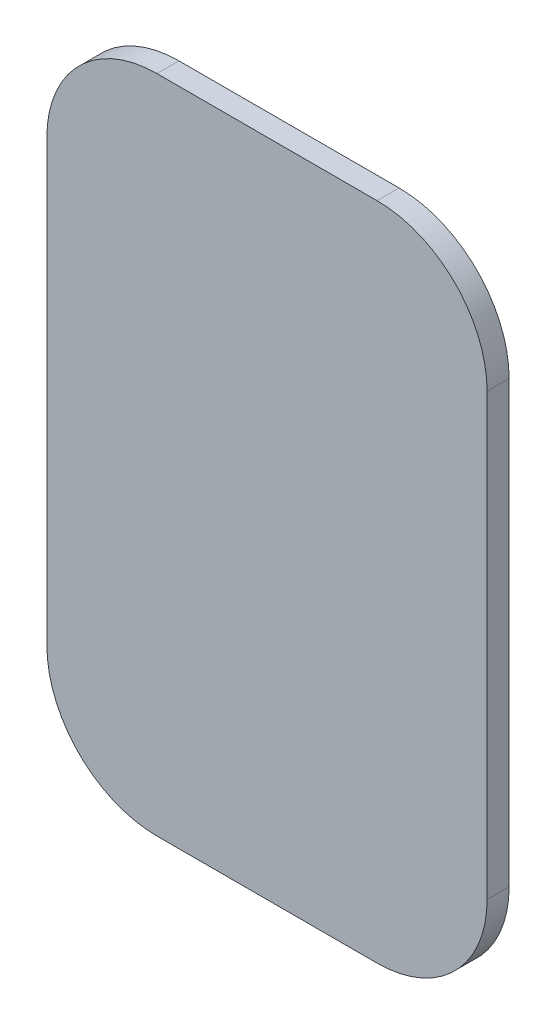
ISO-10303-21;
HEADER;
FILE_DESCRIPTION(('STEP AP214'),'2;1');
FILE_NAME('part.step','',(''),(''),'','','');
FILE_SCHEMA(('AUTOMOTIVE_DESIGN { 1 0 10303 214 1 1 1 1 }'));
ENDSEC;
DATA;
#1=APPLICATION_CONTEXT('core data for automotive mechanical design processes');
#2=APPLICATION_PROTOCOL_DEFINITION('international standard','automotive_design',2000,#1);
#3=PRODUCT_CONTEXT('',#1,'mechanical');
#4=PRODUCT('Part','Part','',(#3));
#5=PRODUCT_RELATED_PRODUCT_CATEGORY('part','',(#4));
#6=PRODUCT_DEFINITION_FORMATION('','',#4);
#7=PRODUCT_DEFINITION_CONTEXT('part definition',#1,'design');
#8=PRODUCT_DEFINITION('design','',#6,#7);
#9=PRODUCT_DEFINITION_SHAPE('','',#8);
#10=(LENGTH_UNIT() NAMED_UNIT(*) SI_UNIT(.MILLI.,.METRE.));
#11=(NAMED_UNIT(*) PLANE_ANGLE_UNIT() SI_UNIT($,.RADIAN.));
#12=(NAMED_UNIT(*) SI_UNIT($,.STERADIAN.) SOLID_ANGLE_UNIT());
#13=UNCERTAINTY_MEASURE_WITH_UNIT(LENGTH_MEASURE(1.E-05),#10,'distance_accuracy_value','');
#14=(GEOMETRIC_REPRESENTATION_CONTEXT(3) GLOBAL_UNCERTAINTY_ASSIGNED_CONTEXT((#13)) GLOBAL_UNIT_ASSIGNED_CONTEXT((#10,
#11,#12)) REPRESENTATION_CONTEXT('',''));
#15=CARTESIAN_POINT('',(0.,0.,0.));
#16=DIRECTION('',(0.,0.,1.));
#17=DIRECTION('',(1.,0.,0.));
#18=AXIS2_PLACEMENT_3D('',#15,#16,#17);
#19=CARTESIAN_POINT('',(13.7838920146643,-25.264510751792,-2.54));
#20=DIRECTION('',(0.,0.,1.));
#21=DIRECTION('',(1.,0.,0.));
#22=AXIS2_PLACEMENT_3D('',#19,#20,#21);
#23=CYLINDRICAL_SURFACE('',#22,12.7);
#24=CARTESIAN_POINT('',(13.7838920146643,-25.264510751792,0.));
#25=DIRECTION('',(0.,0.,1.));
#26=DIRECTION('',(1.,0.,0.));
#27=AXIS2_PLACEMENT_3D('',#24,#25,#26);
#28=CIRCLE('',#27,12.7);
#29=CARTESIAN_POINT('',(13.7838920146643,-37.964510751792,0.));
#30=VERTEX_POINT('',#29);
#31=CARTESIAN_POINT('',(26.4838920146643,-25.264510751792,0.));
#32=VERTEX_POINT('',#31);
#33=EDGE_CURVE('E138',#30,#32,#28,.T.);
#34=ORIENTED_EDGE('',*,*,#33,.F.);
#35=DIRECTION('',(0.,0.,1.));
#36=VECTOR('',#35,1.);
#37=CARTESIAN_POINT('',(13.7838920146643,-37.964510751792,-2.54));
#38=LINE('',#37,#36);
#39=CARTESIAN_POINT('',(13.7838920146643,-37.964510751792,-2.54));
#40=VERTEX_POINT('',#39);
#41=EDGE_CURVE('E11',#40,#30,#38,.T.);
#42=ORIENTED_EDGE('',*,*,#41,.F.);
#43=CARTESIAN_POINT('',(13.7838920146643,-25.264510751792,-2.54));
#44=DIRECTION('',(0.,0.,1.));
#45=DIRECTION('',(1.,0.,0.));
#46=AXIS2_PLACEMENT_3D('',#43,#44,#45);
#47=CIRCLE('',#46,12.7);
#48=CARTESIAN_POINT('',(26.4838920146643,-25.264510751792,-2.54));
#49=VERTEX_POINT('',#48);
#50=EDGE_CURVE('E158',#40,#49,#47,.T.);
#51=ORIENTED_EDGE('',*,*,#50,.T.);
#52=DIRECTION('',(0.,0.,1.));
#53=VECTOR('',#52,1.);
#54=CARTESIAN_POINT('',(26.4838920146643,-25.264510751792,-2.54));
#55=LINE('',#54,#53);
#56=EDGE_CURVE('E44',#49,#32,#55,.T.);
#57=ORIENTED_EDGE('',*,*,#56,.T.);
#58=EDGE_LOOP('',(#34,#42,#51,#57));
#59=FACE_BOUND('',#58,.T.);
#60=ADVANCED_FACE('F41',(#59),#23,.T.);
#61=CARTESIAN_POINT('',(-11.6160640433357,-37.964510751792,-2.54));
#62=DIRECTION('',(0.,-1.,0.));
#63=DIRECTION('',(0.,0.,-1.));
#64=AXIS2_PLACEMENT_3D('',#61,#62,#63);
#65=PLANE('',#64);
#66=DIRECTION('',(1.,0.,0.));
#67=VECTOR('',#66,1.);
#68=CARTESIAN_POINT('',(-11.6160640433357,-37.964510751792,0.));
#69=LINE('',#68,#67);
#70=CARTESIAN_POINT('',(-11.6160640433357,-37.964510751792,0.));
#71=VERTEX_POINT('',#70);
#72=EDGE_CURVE('E156',#71,#30,#69,.T.);
#73=ORIENTED_EDGE('',*,*,#72,.F.);
#74=DIRECTION('',(0.,0.,1.));
#75=VECTOR('',#74,1.);
#76=CARTESIAN_POINT('',(-11.6160640433357,-37.964510751792,-2.54));
#77=LINE('',#76,#75);
#78=CARTESIAN_POINT('',(-11.6160640433357,-37.964510751792,-2.54));
#79=VERTEX_POINT('',#78);
#80=EDGE_CURVE('E50',#79,#71,#77,.T.);
#81=ORIENTED_EDGE('',*,*,#80,.F.);
#82=DIRECTION('',(1.,0.,0.));
#83=VECTOR('',#82,1.);
#84=CARTESIAN_POINT('',(-11.6160640433357,-37.964510751792,-2.54));
#85=LINE('',#84,#83);
#86=EDGE_CURVE('E128',#79,#40,#85,.T.);
#87=ORIENTED_EDGE('',*,*,#86,.T.);
#88=ORIENTED_EDGE('',*,*,#41,.T.);
#89=EDGE_LOOP('',(#73,#81,#87,#88));
#90=FACE_BOUND('',#89,.T.);
#91=ADVANCED_FACE('F170',(#90),#65,.T.);
#92=CARTESIAN_POINT('',(-11.6160640433357,-25.264510751792,-2.54));
#93=DIRECTION('',(0.,0.,1.));
#94=DIRECTION('',(1.,0.,0.));
#95=AXIS2_PLACEMENT_3D('',#92,#93,#94);
#96=CYLINDRICAL_SURFACE('',#95,12.7);
#97=CARTESIAN_POINT('',(-11.6160640433357,-25.264510751792,0.));
#98=DIRECTION('',(0.,0.,1.));
#99=DIRECTION('',(1.,0.,0.));
#100=AXIS2_PLACEMENT_3D('',#97,#98,#99);
#101=CIRCLE('',#100,12.7);
#102=CARTESIAN_POINT('',(-24.3160640433357,-25.264510751792,0.));
#103=VERTEX_POINT('',#102);
#104=EDGE_CURVE('E115',#103,#71,#101,.T.);
#105=ORIENTED_EDGE('',*,*,#104,.F.);
#106=DIRECTION('',(0.,0.,1.));
#107=VECTOR('',#106,1.);
#108=CARTESIAN_POINT('',(-24.3160640433357,-25.264510751792,-2.54));
#109=LINE('',#108,#107);
#110=CARTESIAN_POINT('',(-24.3160640433357,-25.264510751792,-2.54));
#111=VERTEX_POINT('',#110);
#112=EDGE_CURVE('E110',#111,#103,#109,.T.);
#113=ORIENTED_EDGE('',*,*,#112,.F.);
#114=CARTESIAN_POINT('',(-11.6160640433357,-25.264510751792,-2.54));
#115=DIRECTION('',(0.,0.,1.));
#116=DIRECTION('',(1.,0.,0.));
#117=AXIS2_PLACEMENT_3D('',#114,#115,#116);
#118=CIRCLE('',#117,12.7);
#119=EDGE_CURVE('E113',#111,#79,#118,.T.);
#120=ORIENTED_EDGE('',*,*,#119,.T.);
#121=ORIENTED_EDGE('',*,*,#80,.T.);
#122=EDGE_LOOP('',(#105,#113,#120,#121));
#123=FACE_BOUND('',#122,.T.);
#124=ADVANCED_FACE('F112',(#123),#96,.T.);
#125=CARTESIAN_POINT('',(-24.3160640433357,25.535489248208,-2.54));
#126=DIRECTION('',(-1.,0.,0.));
#127=DIRECTION('',(0.,-1.,0.));
#128=AXIS2_PLACEMENT_3D('',#125,#126,#127);
#129=PLANE('',#128);
#130=DIRECTION('',(0.,-1.,0.));
#131=VECTOR('',#130,1.);
#132=CARTESIAN_POINT('',(-24.3160640433357,25.535489248208,0.));
#133=LINE('',#132,#131);
#134=CARTESIAN_POINT('',(-24.3160640433357,25.535489248208,0.));
#135=VERTEX_POINT('',#134);
#136=EDGE_CURVE('E153',#135,#103,#133,.T.);
#137=ORIENTED_EDGE('',*,*,#136,.F.);
#138=DIRECTION('',(0.,0.,1.));
#139=VECTOR('',#138,1.);
#140=CARTESIAN_POINT('',(-24.3160640433357,25.535489248208,-2.54));
#141=LINE('',#140,#139);
#142=CARTESIAN_POINT('',(-24.3160640433357,25.535489248208,-2.54));
#143=VERTEX_POINT('',#142);
#144=EDGE_CURVE('E120',#143,#135,#141,.T.);
#145=ORIENTED_EDGE('',*,*,#144,.F.);
#146=DIRECTION('',(0.,-1.,0.));
#147=VECTOR('',#146,1.);
#148=CARTESIAN_POINT('',(-24.3160640433357,25.535489248208,-2.54));
#149=LINE('',#148,#147);
#150=EDGE_CURVE('E126',#143,#111,#149,.T.);
#151=ORIENTED_EDGE('',*,*,#150,.T.);
#152=ORIENTED_EDGE('',*,*,#112,.T.);
#153=EDGE_LOOP('',(#137,#145,#151,#152));
#154=FACE_BOUND('',#153,.T.);
#155=ADVANCED_FACE('F130',(#154),#129,.T.);
#156=CARTESIAN_POINT('',(-11.6160640433357,25.535489248208,-2.54));
#157=DIRECTION('',(0.,0.,1.));
#158=DIRECTION('',(1.,0.,0.));
#159=AXIS2_PLACEMENT_3D('',#156,#157,#158);
#160=CYLINDRICAL_SURFACE('',#159,12.7);
#161=CARTESIAN_POINT('',(-11.6160640433357,25.535489248208,0.));
#162=DIRECTION('',(0.,0.,1.));
#163=DIRECTION('',(1.,0.,0.));
#164=AXIS2_PLACEMENT_3D('',#161,#162,#163);
#165=CIRCLE('',#164,12.7);
#166=CARTESIAN_POINT('',(-11.6160640433357,38.235489248208,0.));
#167=VERTEX_POINT('',#166);
#168=EDGE_CURVE('E150',#167,#135,#165,.T.);
#169=ORIENTED_EDGE('',*,*,#168,.F.);
#170=DIRECTION('',(0.,0.,1.));
#171=VECTOR('',#170,1.);
#172=CARTESIAN_POINT('',(-11.6160640433357,38.235489248208,-2.54));
#173=LINE('',#172,#171);
#174=CARTESIAN_POINT('',(-11.6160640433357,38.235489248208,-2.54));
#175=VERTEX_POINT('',#174);
#176=EDGE_CURVE('E162',#175,#167,#173,.T.);
#177=ORIENTED_EDGE('',*,*,#176,.F.);
#178=CARTESIAN_POINT('',(-11.6160640433357,25.535489248208,-2.54));
#179=DIRECTION('',(0.,0.,1.));
#180=DIRECTION('',(1.,0.,0.));
#181=AXIS2_PLACEMENT_3D('',#178,#179,#180);
#182=CIRCLE('',#181,12.7);
#183=EDGE_CURVE('E131',#175,#143,#182,.T.);
#184=ORIENTED_EDGE('',*,*,#183,.T.);
#185=ORIENTED_EDGE('',*,*,#144,.T.);
#186=EDGE_LOOP('',(#169,#177,#184,#185));
#187=FACE_BOUND('',#186,.T.);
#188=ADVANCED_FACE('F183',(#187),#160,.T.);
#189=CARTESIAN_POINT('',(13.7838920146643,38.235489248208,-2.54));
#190=DIRECTION('',(0.,1.,0.));
#191=DIRECTION('',(0.,0.,1.));
#192=AXIS2_PLACEMENT_3D('',#189,#190,#191);
#193=PLANE('',#192);
#194=DIRECTION('',(-1.,0.,0.));
#195=VECTOR('',#194,1.);
#196=CARTESIAN_POINT('',(13.7838920146643,38.235489248208,0.));
#197=LINE('',#196,#195);
#198=CARTESIAN_POINT('',(13.7838920146643,38.235489248208,0.));
#199=VERTEX_POINT('',#198);
#200=EDGE_CURVE('E147',#199,#167,#197,.T.);
#201=ORIENTED_EDGE('',*,*,#200,.F.);
#202=DIRECTION('',(0.,0.,1.));
#203=VECTOR('',#202,1.);
#204=CARTESIAN_POINT('',(13.7838920146643,38.235489248208,-2.54));
#205=LINE('',#204,#203);
#206=CARTESIAN_POINT('',(13.7838920146643,38.235489248208,-2.54));
#207=VERTEX_POINT('',#206);
#208=EDGE_CURVE('E164',#207,#199,#205,.T.);
#209=ORIENTED_EDGE('',*,*,#208,.F.);
#210=DIRECTION('',(-1.,0.,0.));
#211=VECTOR('',#210,1.);
#212=CARTESIAN_POINT('',(13.7838920146643,38.235489248208,-2.54));
#213=LINE('',#212,#211);
#214=EDGE_CURVE('E133',#207,#175,#213,.T.);
#215=ORIENTED_EDGE('',*,*,#214,.T.);
#216=ORIENTED_EDGE('',*,*,#176,.T.);
#217=EDGE_LOOP('',(#201,#209,#215,#216));
#218=FACE_BOUND('',#217,.T.);
#219=ADVANCED_FACE('F186',(#218),#193,.T.);
#220=CARTESIAN_POINT('',(13.7838920146643,25.535489248208,-2.54));
#221=DIRECTION('',(0.,0.,1.));
#222=DIRECTION('',(1.,0.,0.));
#223=AXIS2_PLACEMENT_3D('',#220,#221,#222);
#224=CYLINDRICAL_SURFACE('',#223,12.7);
#225=CARTESIAN_POINT('',(13.7838920146643,25.535489248208,0.));
#226=DIRECTION('',(0.,0.,1.));
#227=DIRECTION('',(1.,0.,0.));
#228=AXIS2_PLACEMENT_3D('',#225,#226,#227);
#229=CIRCLE('',#228,12.7);
#230=CARTESIAN_POINT('',(26.4838920146643,25.535489248208,0.));
#231=VERTEX_POINT('',#230);
#232=EDGE_CURVE('E144',#231,#199,#229,.T.);
#233=ORIENTED_EDGE('',*,*,#232,.F.);
#234=DIRECTION('',(0.,0.,1.));
#235=VECTOR('',#234,1.);
#236=CARTESIAN_POINT('',(26.4838920146643,25.535489248208,-2.54));
#237=LINE('',#236,#235);
#238=CARTESIAN_POINT('',(26.4838920146643,25.535489248208,-2.54));
#239=VERTEX_POINT('',#238);
#240=EDGE_CURVE('E165',#239,#231,#237,.T.);
#241=ORIENTED_EDGE('',*,*,#240,.F.);
#242=CARTESIAN_POINT('',(13.7838920146643,25.535489248208,-2.54));
#243=DIRECTION('',(0.,0.,1.));
#244=DIRECTION('',(1.,0.,0.));
#245=AXIS2_PLACEMENT_3D('',#242,#243,#244);
#246=CIRCLE('',#245,12.7);
#247=EDGE_CURVE('E283',#239,#207,#246,.T.);
#248=ORIENTED_EDGE('',*,*,#247,.T.);
#249=ORIENTED_EDGE('',*,*,#208,.T.);
#250=EDGE_LOOP('',(#233,#241,#248,#249));
#251=FACE_BOUND('',#250,.T.);
#252=ADVANCED_FACE('F190',(#251),#224,.T.);
#253=CARTESIAN_POINT('',(26.4838920146643,-25.264510751792,-2.54));
#254=DIRECTION('',(1.,0.,0.));
#255=DIRECTION('',(0.,0.,-1.));
#256=AXIS2_PLACEMENT_3D('',#253,#254,#255);
#257=PLANE('',#256);
#258=DIRECTION('',(0.,1.,0.));
#259=VECTOR('',#258,1.);
#260=CARTESIAN_POINT('',(26.4838920146643,-25.264510751792,0.));
#261=LINE('',#260,#259);
#262=EDGE_CURVE('E141',#32,#231,#261,.T.);
#263=ORIENTED_EDGE('',*,*,#262,.F.);
#264=ORIENTED_EDGE('',*,*,#56,.F.);
#265=DIRECTION('',(0.,1.,0.));
#266=VECTOR('',#265,1.);
#267=CARTESIAN_POINT('',(26.4838920146643,-25.264510751792,-2.54));
#268=LINE('',#267,#266);
#269=EDGE_CURVE('E284',#49,#239,#268,.T.);
#270=ORIENTED_EDGE('',*,*,#269,.T.);
#271=ORIENTED_EDGE('',*,*,#240,.T.);
#272=EDGE_LOOP('',(#263,#264,#270,#271));
#273=FACE_BOUND('',#272,.T.);
#274=ADVANCED_FACE('F167',(#273),#257,.T.);
#275=CARTESIAN_POINT('',(13.7838920146643,-25.264510751792,-2.54));
#276=DIRECTION('',(0.,0.,1.));
#277=DIRECTION('',(1.,0.,0.));
#278=AXIS2_PLACEMENT_3D('',#275,#276,#277);
#279=PLANE('',#278);
#280=ORIENTED_EDGE('',*,*,#50,.F.);
#281=ORIENTED_EDGE('',*,*,#86,.F.);
#282=ORIENTED_EDGE('',*,*,#119,.F.);
#283=ORIENTED_EDGE('',*,*,#150,.F.);
#284=ORIENTED_EDGE('',*,*,#183,.F.);
#285=ORIENTED_EDGE('',*,*,#214,.F.);
#286=ORIENTED_EDGE('',*,*,#247,.F.);
#287=ORIENTED_EDGE('',*,*,#269,.F.);
#288=EDGE_LOOP('',(#280,#281,#282,#283,#284,#285,#286,#287));
#289=FACE_BOUND('',#288,.T.);
#290=ADVANCED_FACE('F124',(#289),#279,.F.);
#291=CARTESIAN_POINT('',(13.7838920146643,-25.264510751792,0.));
#292=DIRECTION('',(0.,0.,1.));
#293=DIRECTION('',(1.,0.,0.));
#294=AXIS2_PLACEMENT_3D('',#291,#292,#293);
#295=PLANE('',#294);
#296=ORIENTED_EDGE('',*,*,#33,.T.);
#297=ORIENTED_EDGE('',*,*,#262,.T.);
#298=ORIENTED_EDGE('',*,*,#232,.T.);
#299=ORIENTED_EDGE('',*,*,#200,.T.);
#300=ORIENTED_EDGE('',*,*,#168,.T.);
#301=ORIENTED_EDGE('',*,*,#136,.T.);
#302=ORIENTED_EDGE('',*,*,#104,.T.);
#303=ORIENTED_EDGE('',*,*,#72,.T.);
#304=EDGE_LOOP('',(#296,#297,#298,#299,#300,#301,#302,#303));
#305=FACE_BOUND('',#304,.T.);
#306=ADVANCED_FACE('F169',(#305),#295,.T.);
#307=CLOSED_SHELL('',(#60,#91,#124,#155,#188,#219,#252,#274,#290,#306));
#308=MANIFOLD_SOLID_BREP('B2',#307);
#309=ADVANCED_BREP_SHAPE_REPRESENTATION('',(#18,#308),#14);
#310=SHAPE_DEFINITION_REPRESENTATION(#9,#309);
ENDSEC;
END-ISO-10303-21;
